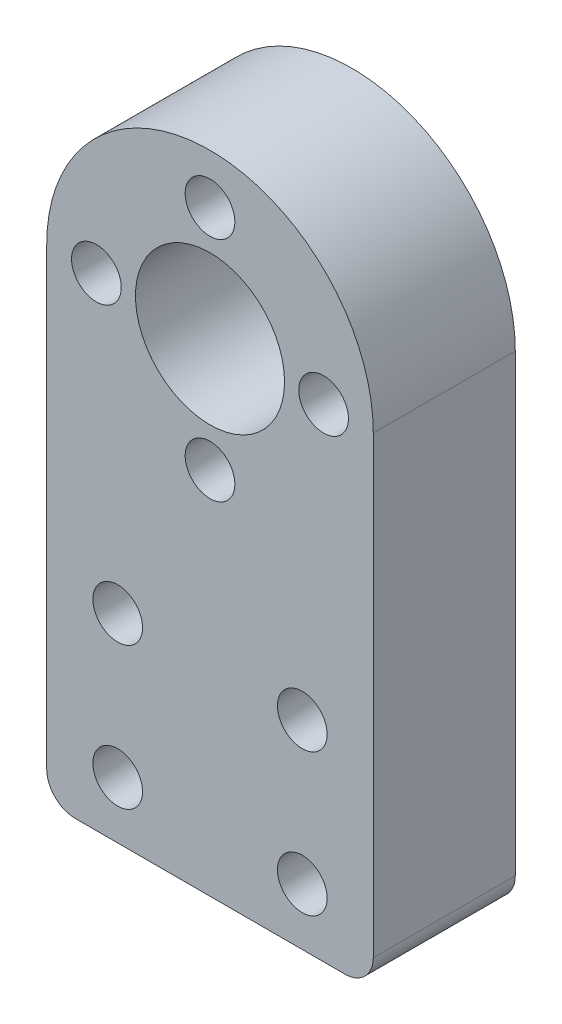
ISO-10303-21;
HEADER;
FILE_DESCRIPTION(('STEP AP214'),'2;1');
FILE_NAME('part.step','',(''),(''),'','','');
FILE_SCHEMA(('AUTOMOTIVE_DESIGN { 1 0 10303 214 1 1 1 1 }'));
ENDSEC;
DATA;
#1=APPLICATION_CONTEXT('core data for automotive mechanical design processes');
#2=APPLICATION_PROTOCOL_DEFINITION('international standard','automotive_design',2000,#1);
#3=PRODUCT_CONTEXT('',#1,'mechanical');
#4=PRODUCT('Part','Part','',(#3));
#5=PRODUCT_RELATED_PRODUCT_CATEGORY('part','',(#4));
#6=PRODUCT_DEFINITION_FORMATION('','',#4);
#7=PRODUCT_DEFINITION_CONTEXT('part definition',#1,'design');
#8=PRODUCT_DEFINITION('design','',#6,#7);
#9=PRODUCT_DEFINITION_SHAPE('','',#8);
#10=(LENGTH_UNIT() NAMED_UNIT(*) SI_UNIT(.MILLI.,.METRE.));
#11=(NAMED_UNIT(*) PLANE_ANGLE_UNIT() SI_UNIT($,.RADIAN.));
#12=(NAMED_UNIT(*) SI_UNIT($,.STERADIAN.) SOLID_ANGLE_UNIT());
#13=UNCERTAINTY_MEASURE_WITH_UNIT(LENGTH_MEASURE(1.E-05),#10,'distance_accuracy_value','');
#14=(GEOMETRIC_REPRESENTATION_CONTEXT(3) GLOBAL_UNCERTAINTY_ASSIGNED_CONTEXT((#13)) GLOBAL_UNIT_ASSIGNED_CONTEXT((#10,
#11,#12)) REPRESENTATION_CONTEXT('',''));
#15=CARTESIAN_POINT('',(0.,0.,0.));
#16=DIRECTION('',(0.,0.,1.));
#17=DIRECTION('',(1.,0.,0.));
#18=AXIS2_PLACEMENT_3D('',#15,#16,#17);
#19=CARTESIAN_POINT('',(0.,17.,10.));
#20=DIRECTION('',(0.,0.,-1.));
#21=DIRECTION('',(-1.,0.,0.));
#22=AXIS2_PLACEMENT_3D('',#19,#20,#21);
#23=CYLINDRICAL_SURFACE('',#22,11.5);
#24=CARTESIAN_POINT('',(0.,17.,0.));
#25=DIRECTION('',(0.,0.,1.));
#26=DIRECTION('',(1.,0.,0.));
#27=AXIS2_PLACEMENT_3D('',#24,#25,#26);
#28=CIRCLE('',#27,11.5);
#29=CARTESIAN_POINT('',(11.5,17.,0.));
#30=VERTEX_POINT('',#29);
#31=CARTESIAN_POINT('',(-11.5,17.,0.));
#32=VERTEX_POINT('',#31);
#33=EDGE_CURVE('E106',#30,#32,#28,.T.);
#34=ORIENTED_EDGE('',*,*,#33,.T.);
#35=DIRECTION('',(0.,0.,-1.));
#36=VECTOR('',#35,1.);
#37=CARTESIAN_POINT('',(-11.5,17.,10.));
#38=LINE('',#37,#36);
#39=CARTESIAN_POINT('',(-11.5,17.,10.));
#40=VERTEX_POINT('',#39);
#41=EDGE_CURVE('E91',#40,#32,#38,.T.);
#42=ORIENTED_EDGE('',*,*,#41,.F.);
#43=CARTESIAN_POINT('',(0.,17.,10.));
#44=DIRECTION('',(0.,0.,1.));
#45=DIRECTION('',(1.,0.,0.));
#46=AXIS2_PLACEMENT_3D('',#43,#44,#45);
#47=CIRCLE('',#46,11.5);
#48=CARTESIAN_POINT('',(11.5,17.,10.));
#49=VERTEX_POINT('',#48);
#50=EDGE_CURVE('E95',#49,#40,#47,.T.);
#51=ORIENTED_EDGE('',*,*,#50,.F.);
#52=DIRECTION('',(0.,0.,-1.));
#53=VECTOR('',#52,1.);
#54=CARTESIAN_POINT('',(11.5,17.,10.));
#55=LINE('',#54,#53);
#56=EDGE_CURVE('E108',#49,#30,#55,.T.);
#57=ORIENTED_EDGE('',*,*,#56,.T.);
#58=EDGE_LOOP('',(#34,#42,#51,#57));
#59=FACE_BOUND('',#58,.T.);
#60=ADVANCED_FACE('F34',(#59),#23,.T.);
#61=CARTESIAN_POINT('',(-11.5,-17.,10.));
#62=DIRECTION('',(1.,0.,0.));
#63=DIRECTION('',(0.,0.,-1.));
#64=AXIS2_PLACEMENT_3D('',#61,#62,#63);
#65=PLANE('',#64);
#66=DIRECTION('',(0.,-1.,0.));
#67=VECTOR('',#66,1.);
#68=CARTESIAN_POINT('',(-11.5,-17.,0.));
#69=LINE('',#68,#67);
#70=CARTESIAN_POINT('',(-11.5,-15.,0.));
#71=VERTEX_POINT('',#70);
#72=EDGE_CURVE('E134',#32,#71,#69,.T.);
#73=ORIENTED_EDGE('',*,*,#72,.T.);
#74=DIRECTION('',(0.,0.,-1.));
#75=VECTOR('',#74,1.);
#76=CARTESIAN_POINT('',(-11.5,-15.,10.));
#77=LINE('',#76,#75);
#78=CARTESIAN_POINT('',(-11.5,-15.,10.));
#79=VERTEX_POINT('',#78);
#80=EDGE_CURVE('E57',#71,#79,#77,.F.);
#81=ORIENTED_EDGE('',*,*,#80,.T.);
#82=DIRECTION('',(0.,-1.,0.));
#83=VECTOR('',#82,1.);
#84=CARTESIAN_POINT('',(-11.5,-17.,10.));
#85=LINE('',#84,#83);
#86=EDGE_CURVE('E87',#40,#79,#85,.T.);
#87=ORIENTED_EDGE('',*,*,#86,.F.);
#88=ORIENTED_EDGE('',*,*,#41,.T.);
#89=EDGE_LOOP('',(#73,#81,#87,#88));
#90=FACE_BOUND('',#89,.T.);
#91=ADVANCED_FACE('F89',(#90),#65,.F.);
#92=CARTESIAN_POINT('',(11.5,-17.,10.));
#93=DIRECTION('',(0.,1.,0.));
#94=DIRECTION('',(-1.,0.,0.));
#95=AXIS2_PLACEMENT_3D('',#92,#93,#94);
#96=PLANE('',#95);
#97=DIRECTION('',(1.,0.,0.));
#98=VECTOR('',#97,1.);
#99=CARTESIAN_POINT('',(11.5,-17.,10.));
#100=LINE('',#99,#98);
#101=CARTESIAN_POINT('',(-9.5,-17.,10.));
#102=VERTEX_POINT('',#101);
#103=CARTESIAN_POINT('',(9.5,-17.,10.));
#104=VERTEX_POINT('',#103);
#105=EDGE_CURVE('E94',#102,#104,#100,.T.);
#106=ORIENTED_EDGE('',*,*,#105,.F.);
#107=DIRECTION('',(0.,0.,-1.));
#108=VECTOR('',#107,1.);
#109=CARTESIAN_POINT('',(-9.5,-17.,10.));
#110=LINE('',#109,#108);
#111=CARTESIAN_POINT('',(-9.5,-17.,0.));
#112=VERTEX_POINT('',#111);
#113=EDGE_CURVE('E110',#102,#112,#110,.T.);
#114=ORIENTED_EDGE('',*,*,#113,.T.);
#115=DIRECTION('',(1.,0.,0.));
#116=VECTOR('',#115,1.);
#117=CARTESIAN_POINT('',(11.5,-17.,0.));
#118=LINE('',#117,#116);
#119=CARTESIAN_POINT('',(9.5,-17.,0.));
#120=VERTEX_POINT('',#119);
#121=EDGE_CURVE('E135',#112,#120,#118,.T.);
#122=ORIENTED_EDGE('',*,*,#121,.T.);
#123=DIRECTION('',(0.,0.,-1.));
#124=VECTOR('',#123,1.);
#125=CARTESIAN_POINT('',(9.5,-17.,10.));
#126=LINE('',#125,#124);
#127=EDGE_CURVE('E107',#120,#104,#126,.F.);
#128=ORIENTED_EDGE('',*,*,#127,.T.);
#129=EDGE_LOOP('',(#106,#114,#122,#128));
#130=FACE_BOUND('',#129,.T.);
#131=ADVANCED_FACE('F126',(#130),#96,.F.);
#132=CARTESIAN_POINT('',(11.5,-17.,10.));
#133=DIRECTION('',(-1.,0.,0.));
#134=DIRECTION('',(0.,0.,1.));
#135=AXIS2_PLACEMENT_3D('',#132,#133,#134);
#136=PLANE('',#135);
#137=DIRECTION('',(0.,1.,0.));
#138=VECTOR('',#137,1.);
#139=CARTESIAN_POINT('',(11.5,-17.,10.));
#140=LINE('',#139,#138);
#141=CARTESIAN_POINT('',(11.5,-15.,10.));
#142=VERTEX_POINT('',#141);
#143=EDGE_CURVE('E99',#142,#49,#140,.T.);
#144=ORIENTED_EDGE('',*,*,#143,.F.);
#145=DIRECTION('',(0.,0.,-1.));
#146=VECTOR('',#145,1.);
#147=CARTESIAN_POINT('',(11.5,-15.,10.));
#148=LINE('',#147,#146);
#149=CARTESIAN_POINT('',(11.5,-15.,0.));
#150=VERTEX_POINT('',#149);
#151=EDGE_CURVE('E11',#142,#150,#148,.T.);
#152=ORIENTED_EDGE('',*,*,#151,.T.);
#153=DIRECTION('',(0.,1.,0.));
#154=VECTOR('',#153,1.);
#155=CARTESIAN_POINT('',(11.5,-17.,0.));
#156=LINE('',#155,#154);
#157=EDGE_CURVE('E103',#150,#30,#156,.T.);
#158=ORIENTED_EDGE('',*,*,#157,.T.);
#159=ORIENTED_EDGE('',*,*,#56,.F.);
#160=EDGE_LOOP('',(#144,#152,#158,#159));
#161=FACE_BOUND('',#160,.T.);
#162=ADVANCED_FACE('F143',(#161),#136,.F.);
#163=CARTESIAN_POINT('',(0.,17.,10.));
#164=DIRECTION('',(0.,0.,1.));
#165=DIRECTION('',(1.,0.,0.));
#166=AXIS2_PLACEMENT_3D('',#163,#164,#165);
#167=PLANE('',#166);
#168=CARTESIAN_POINT('',(6.5,-13.,10.));
#169=DIRECTION('',(0.,0.,1.));
#170=DIRECTION('',(1.,0.,0.));
#171=AXIS2_PLACEMENT_3D('',#168,#169,#170);
#172=CIRCLE('',#171,1.75);
#173=CARTESIAN_POINT('',(8.25,-13.,10.));
#174=VERTEX_POINT('',#173);
#175=EDGE_CURVE('E228',#174,#174,#172,.F.);
#176=ORIENTED_EDGE('',*,*,#175,.T.);
#177=EDGE_LOOP('',(#176));
#178=FACE_BOUND('',#177,.T.);
#179=CARTESIAN_POINT('',(-6.5,-13.,10.));
#180=DIRECTION('',(0.,0.,1.));
#181=DIRECTION('',(1.,0.,0.));
#182=AXIS2_PLACEMENT_3D('',#179,#180,#181);
#183=CIRCLE('',#182,1.75);
#184=CARTESIAN_POINT('',(-4.75,-13.,10.));
#185=VERTEX_POINT('',#184);
#186=EDGE_CURVE('E222',#185,#185,#183,.F.);
#187=ORIENTED_EDGE('',*,*,#186,.T.);
#188=EDGE_LOOP('',(#187));
#189=FACE_BOUND('',#188,.T.);
#190=CARTESIAN_POINT('',(-6.5,-3.,10.));
#191=DIRECTION('',(0.,0.,1.));
#192=DIRECTION('',(1.,0.,0.));
#193=AXIS2_PLACEMENT_3D('',#190,#191,#192);
#194=CIRCLE('',#193,1.75);
#195=CARTESIAN_POINT('',(-4.75,-3.,10.));
#196=VERTEX_POINT('',#195);
#197=EDGE_CURVE('E207',#196,#196,#194,.F.);
#198=ORIENTED_EDGE('',*,*,#197,.T.);
#199=EDGE_LOOP('',(#198));
#200=FACE_BOUND('',#199,.T.);
#201=CARTESIAN_POINT('',(6.5,-3.,10.));
#202=DIRECTION('',(0.,0.,1.));
#203=DIRECTION('',(1.,0.,0.));
#204=AXIS2_PLACEMENT_3D('',#201,#202,#203);
#205=CIRCLE('',#204,1.75);
#206=CARTESIAN_POINT('',(8.25,-3.,10.));
#207=VERTEX_POINT('',#206);
#208=EDGE_CURVE('E212',#207,#207,#205,.F.);
#209=ORIENTED_EDGE('',*,*,#208,.T.);
#210=EDGE_LOOP('',(#209));
#211=FACE_BOUND('',#210,.T.);
#212=CARTESIAN_POINT('',(0.,25.,10.));
#213=DIRECTION('',(0.,0.,1.));
#214=DIRECTION('',(1.,0.,0.));
#215=AXIS2_PLACEMENT_3D('',#212,#213,#214);
#216=CIRCLE('',#215,1.75);
#217=CARTESIAN_POINT('',(1.75,25.,10.));
#218=VERTEX_POINT('',#217);
#219=EDGE_CURVE('E238',#218,#218,#216,.F.);
#220=ORIENTED_EDGE('',*,*,#219,.T.);
#221=EDGE_LOOP('',(#220));
#222=FACE_BOUND('',#221,.T.);
#223=CARTESIAN_POINT('',(-8.,17.,10.));
#224=DIRECTION('',(0.,0.,1.));
#225=DIRECTION('',(1.,0.,0.));
#226=AXIS2_PLACEMENT_3D('',#223,#224,#225);
#227=CIRCLE('',#226,1.75);
#228=CARTESIAN_POINT('',(-6.25,17.,10.));
#229=VERTEX_POINT('',#228);
#230=EDGE_CURVE('E244',#229,#229,#227,.F.);
#231=ORIENTED_EDGE('',*,*,#230,.T.);
#232=EDGE_LOOP('',(#231));
#233=FACE_BOUND('',#232,.T.);
#234=CARTESIAN_POINT('',(0.,9.00000000000001,10.));
#235=DIRECTION('',(0.,0.,1.));
#236=DIRECTION('',(1.,0.,0.));
#237=AXIS2_PLACEMENT_3D('',#234,#235,#236);
#238=CIRCLE('',#237,1.75);
#239=CARTESIAN_POINT('',(1.75,9.00000000000001,10.));
#240=VERTEX_POINT('',#239);
#241=EDGE_CURVE('E250',#240,#240,#238,.F.);
#242=ORIENTED_EDGE('',*,*,#241,.T.);
#243=EDGE_LOOP('',(#242));
#244=FACE_BOUND('',#243,.T.);
#245=CARTESIAN_POINT('',(8.,17.,10.));
#246=DIRECTION('',(0.,0.,1.));
#247=DIRECTION('',(1.,0.,0.));
#248=AXIS2_PLACEMENT_3D('',#245,#246,#247);
#249=CIRCLE('',#248,1.75);
#250=CARTESIAN_POINT('',(9.75,17.,10.));
#251=VERTEX_POINT('',#250);
#252=EDGE_CURVE('E232',#251,#251,#249,.F.);
#253=ORIENTED_EDGE('',*,*,#252,.T.);
#254=EDGE_LOOP('',(#253));
#255=FACE_BOUND('',#254,.T.);
#256=CARTESIAN_POINT('',(0.,17.,10.));
#257=DIRECTION('',(0.,0.,1.));
#258=DIRECTION('',(1.,0.,0.));
#259=AXIS2_PLACEMENT_3D('',#256,#257,#258);
#260=CIRCLE('',#259,5.25);
#261=CARTESIAN_POINT('',(5.25,17.,10.));
#262=VERTEX_POINT('',#261);
#263=EDGE_CURVE('E237',#262,#262,#260,.T.);
#264=ORIENTED_EDGE('',*,*,#263,.F.);
#265=EDGE_LOOP('',(#264));
#266=FACE_BOUND('',#265,.T.);
#267=ORIENTED_EDGE('',*,*,#86,.T.);
#268=CARTESIAN_POINT('',(-9.5,-15.,10.));
#269=DIRECTION('',(0.,0.,1.));
#270=DIRECTION('',(1.,0.,0.));
#271=AXIS2_PLACEMENT_3D('',#268,#269,#270);
#272=CIRCLE('',#271,2.);
#273=EDGE_CURVE('E42',#79,#102,#272,.T.);
#274=ORIENTED_EDGE('',*,*,#273,.T.);
#275=ORIENTED_EDGE('',*,*,#105,.T.);
#276=CARTESIAN_POINT('',(9.5,-15.,10.));
#277=DIRECTION('',(0.,0.,1.));
#278=DIRECTION('',(1.,0.,0.));
#279=AXIS2_PLACEMENT_3D('',#276,#277,#278);
#280=CIRCLE('',#279,2.);
#281=EDGE_CURVE('E49',#104,#142,#280,.T.);
#282=ORIENTED_EDGE('',*,*,#281,.T.);
#283=ORIENTED_EDGE('',*,*,#143,.T.);
#284=ORIENTED_EDGE('',*,*,#50,.T.);
#285=EDGE_LOOP('',(#267,#274,#275,#282,#283,#284));
#286=FACE_BOUND('',#285,.T.);
#287=ADVANCED_FACE('F98',(#178,#189,#200,#211,#222,#233,#244,#255,#266,#286),#167,.T.);
#288=CARTESIAN_POINT('',(0.,17.,0.));
#289=DIRECTION('',(0.,0.,1.));
#290=DIRECTION('',(1.,0.,0.));
#291=AXIS2_PLACEMENT_3D('',#288,#289,#290);
#292=PLANE('',#291);
#293=CARTESIAN_POINT('',(6.5,-13.,0.));
#294=DIRECTION('',(0.,0.,-1.));
#295=DIRECTION('',(-1.,0.,0.));
#296=AXIS2_PLACEMENT_3D('',#293,#294,#295);
#297=CIRCLE('',#296,1.75);
#298=CARTESIAN_POINT('',(4.75,-13.,0.));
#299=VERTEX_POINT('',#298);
#300=EDGE_CURVE('E225',#299,#299,#297,.T.);
#301=ORIENTED_EDGE('',*,*,#300,.F.);
#302=EDGE_LOOP('',(#301));
#303=FACE_BOUND('',#302,.T.);
#304=CARTESIAN_POINT('',(-6.5,-13.,0.));
#305=DIRECTION('',(0.,0.,-1.));
#306=DIRECTION('',(-1.,0.,0.));
#307=AXIS2_PLACEMENT_3D('',#304,#305,#306);
#308=CIRCLE('',#307,1.75);
#309=CARTESIAN_POINT('',(-8.25,-13.,0.));
#310=VERTEX_POINT('',#309);
#311=EDGE_CURVE('E217',#310,#310,#308,.T.);
#312=ORIENTED_EDGE('',*,*,#311,.F.);
#313=EDGE_LOOP('',(#312));
#314=FACE_BOUND('',#313,.T.);
#315=CARTESIAN_POINT('',(-6.5,-3.,0.));
#316=DIRECTION('',(0.,0.,-1.));
#317=DIRECTION('',(-1.,0.,0.));
#318=AXIS2_PLACEMENT_3D('',#315,#316,#317);
#319=CIRCLE('',#318,1.75);
#320=CARTESIAN_POINT('',(-8.25,-3.,0.));
#321=VERTEX_POINT('',#320);
#322=EDGE_CURVE('E210',#321,#321,#319,.T.);
#323=ORIENTED_EDGE('',*,*,#322,.F.);
#324=EDGE_LOOP('',(#323));
#325=FACE_BOUND('',#324,.T.);
#326=CARTESIAN_POINT('',(6.5,-3.,0.));
#327=DIRECTION('',(0.,0.,-1.));
#328=DIRECTION('',(-1.,0.,0.));
#329=AXIS2_PLACEMENT_3D('',#326,#327,#328);
#330=CIRCLE('',#329,1.75);
#331=CARTESIAN_POINT('',(4.75,-3.,0.));
#332=VERTEX_POINT('',#331);
#333=EDGE_CURVE('E215',#332,#332,#330,.T.);
#334=ORIENTED_EDGE('',*,*,#333,.F.);
#335=EDGE_LOOP('',(#334));
#336=FACE_BOUND('',#335,.T.);
#337=CARTESIAN_POINT('',(0.,25.,0.));
#338=DIRECTION('',(0.,0.,-1.));
#339=DIRECTION('',(-1.,0.,0.));
#340=AXIS2_PLACEMENT_3D('',#337,#338,#339);
#341=CIRCLE('',#340,1.75);
#342=CARTESIAN_POINT('',(-1.75,25.,0.));
#343=VERTEX_POINT('',#342);
#344=EDGE_CURVE('E234',#343,#343,#341,.T.);
#345=ORIENTED_EDGE('',*,*,#344,.F.);
#346=EDGE_LOOP('',(#345));
#347=FACE_BOUND('',#346,.T.);
#348=CARTESIAN_POINT('',(-8.,17.,0.));
#349=DIRECTION('',(0.,0.,-1.));
#350=DIRECTION('',(-1.,0.,0.));
#351=AXIS2_PLACEMENT_3D('',#348,#349,#350);
#352=CIRCLE('',#351,1.75);
#353=CARTESIAN_POINT('',(-9.75,17.,0.));
#354=VERTEX_POINT('',#353);
#355=EDGE_CURVE('E241',#354,#354,#352,.T.);
#356=ORIENTED_EDGE('',*,*,#355,.F.);
#357=EDGE_LOOP('',(#356));
#358=FACE_BOUND('',#357,.T.);
#359=CARTESIAN_POINT('',(0.,9.00000000000001,0.));
#360=DIRECTION('',(0.,0.,-1.));
#361=DIRECTION('',(-1.,0.,0.));
#362=AXIS2_PLACEMENT_3D('',#359,#360,#361);
#363=CIRCLE('',#362,1.75);
#364=CARTESIAN_POINT('',(-1.75,9.00000000000001,0.));
#365=VERTEX_POINT('',#364);
#366=EDGE_CURVE('E247',#365,#365,#363,.T.);
#367=ORIENTED_EDGE('',*,*,#366,.F.);
#368=EDGE_LOOP('',(#367));
#369=FACE_BOUND('',#368,.T.);
#370=CARTESIAN_POINT('',(8.,17.,0.));
#371=DIRECTION('',(0.,0.,-1.));
#372=DIRECTION('',(-1.,0.,0.));
#373=AXIS2_PLACEMENT_3D('',#370,#371,#372);
#374=CIRCLE('',#373,1.75);
#375=CARTESIAN_POINT('',(6.25,17.,0.));
#376=VERTEX_POINT('',#375);
#377=EDGE_CURVE('E253',#376,#376,#374,.T.);
#378=ORIENTED_EDGE('',*,*,#377,.F.);
#379=EDGE_LOOP('',(#378));
#380=FACE_BOUND('',#379,.T.);
#381=CARTESIAN_POINT('',(0.,17.,0.));
#382=DIRECTION('',(0.,0.,1.));
#383=DIRECTION('',(1.,0.,0.));
#384=AXIS2_PLACEMENT_3D('',#381,#382,#383);
#385=CIRCLE('',#384,5.25);
#386=CARTESIAN_POINT('',(5.25,17.,0.));
#387=VERTEX_POINT('',#386);
#388=EDGE_CURVE('E138',#387,#387,#385,.F.);
#389=ORIENTED_EDGE('',*,*,#388,.F.);
#390=EDGE_LOOP('',(#389));
#391=FACE_BOUND('',#390,.T.);
#392=ORIENTED_EDGE('',*,*,#121,.F.);
#393=CARTESIAN_POINT('',(-9.5,-15.,0.));
#394=DIRECTION('',(0.,0.,1.));
#395=DIRECTION('',(1.,0.,0.));
#396=AXIS2_PLACEMENT_3D('',#393,#394,#395);
#397=CIRCLE('',#396,2.);
#398=EDGE_CURVE('E119',#112,#71,#397,.F.);
#399=ORIENTED_EDGE('',*,*,#398,.T.);
#400=ORIENTED_EDGE('',*,*,#72,.F.);
#401=ORIENTED_EDGE('',*,*,#33,.F.);
#402=ORIENTED_EDGE('',*,*,#157,.F.);
#403=CARTESIAN_POINT('',(9.5,-15.,0.));
#404=DIRECTION('',(0.,0.,1.));
#405=DIRECTION('',(1.,0.,0.));
#406=AXIS2_PLACEMENT_3D('',#403,#404,#405);
#407=CIRCLE('',#406,2.);
#408=EDGE_CURVE('E117',#150,#120,#407,.F.);
#409=ORIENTED_EDGE('',*,*,#408,.T.);
#410=EDGE_LOOP('',(#392,#399,#400,#401,#402,#409));
#411=FACE_BOUND('',#410,.T.);
#412=ADVANCED_FACE('F133',(#303,#314,#325,#336,#347,#358,#369,#380,#391,#411),#292,.F.);
#413=CARTESIAN_POINT('',(0.,17.,-0.000999999999999265));
#414=DIRECTION('',(0.,0.,1.));
#415=DIRECTION('',(1.,0.,0.));
#416=AXIS2_PLACEMENT_3D('',#413,#414,#415);
#417=CYLINDRICAL_SURFACE('',#416,5.25);
#418=ORIENTED_EDGE('',*,*,#263,.T.);
#419=EDGE_LOOP('',(#418));
#420=FACE_BOUND('',#419,.T.);
#421=ORIENTED_EDGE('',*,*,#388,.T.);
#422=EDGE_LOOP('',(#421));
#423=FACE_BOUND('',#422,.T.);
#424=ADVANCED_FACE('F164',(#420,#423),#417,.F.);
#425=CARTESIAN_POINT('',(8.,17.,10.001));
#426=DIRECTION('',(0.,0.,-1.));
#427=DIRECTION('',(-1.,0.,0.));
#428=AXIS2_PLACEMENT_3D('',#425,#426,#427);
#429=CYLINDRICAL_SURFACE('',#428,1.75);
#430=ORIENTED_EDGE('',*,*,#252,.F.);
#431=EDGE_LOOP('',(#430));
#432=FACE_BOUND('',#431,.T.);
#433=ORIENTED_EDGE('',*,*,#377,.T.);
#434=EDGE_LOOP('',(#433));
#435=FACE_BOUND('',#434,.T.);
#436=ADVANCED_FACE('F171',(#432,#435),#429,.F.);
#437=CARTESIAN_POINT('',(0.,9.00000000000001,10.001));
#438=DIRECTION('',(0.,0.,-1.));
#439=DIRECTION('',(-1.,0.,0.));
#440=AXIS2_PLACEMENT_3D('',#437,#438,#439);
#441=CYLINDRICAL_SURFACE('',#440,1.75);
#442=ORIENTED_EDGE('',*,*,#241,.F.);
#443=EDGE_LOOP('',(#442));
#444=FACE_BOUND('',#443,.T.);
#445=ORIENTED_EDGE('',*,*,#366,.T.);
#446=EDGE_LOOP('',(#445));
#447=FACE_BOUND('',#446,.T.);
#448=ADVANCED_FACE('F175',(#444,#447),#441,.F.);
#449=CARTESIAN_POINT('',(-8.,17.,10.001));
#450=DIRECTION('',(0.,0.,-1.));
#451=DIRECTION('',(-1.,0.,0.));
#452=AXIS2_PLACEMENT_3D('',#449,#450,#451);
#453=CYLINDRICAL_SURFACE('',#452,1.75);
#454=ORIENTED_EDGE('',*,*,#230,.F.);
#455=EDGE_LOOP('',(#454));
#456=FACE_BOUND('',#455,.T.);
#457=ORIENTED_EDGE('',*,*,#355,.T.);
#458=EDGE_LOOP('',(#457));
#459=FACE_BOUND('',#458,.T.);
#460=ADVANCED_FACE('F179',(#456,#459),#453,.F.);
#461=CARTESIAN_POINT('',(0.,25.,10.001));
#462=DIRECTION('',(0.,0.,-1.));
#463=DIRECTION('',(-1.,0.,0.));
#464=AXIS2_PLACEMENT_3D('',#461,#462,#463);
#465=CYLINDRICAL_SURFACE('',#464,1.75);
#466=ORIENTED_EDGE('',*,*,#219,.F.);
#467=EDGE_LOOP('',(#466));
#468=FACE_BOUND('',#467,.T.);
#469=ORIENTED_EDGE('',*,*,#344,.T.);
#470=EDGE_LOOP('',(#469));
#471=FACE_BOUND('',#470,.T.);
#472=ADVANCED_FACE('F183',(#468,#471),#465,.F.);
#473=CARTESIAN_POINT('',(6.5,-3.,10.001));
#474=DIRECTION('',(0.,0.,-1.));
#475=DIRECTION('',(-1.,0.,0.));
#476=AXIS2_PLACEMENT_3D('',#473,#474,#475);
#477=CYLINDRICAL_SURFACE('',#476,1.75);
#478=ORIENTED_EDGE('',*,*,#208,.F.);
#479=EDGE_LOOP('',(#478));
#480=FACE_BOUND('',#479,.T.);
#481=ORIENTED_EDGE('',*,*,#333,.T.);
#482=EDGE_LOOP('',(#481));
#483=FACE_BOUND('',#482,.T.);
#484=ADVANCED_FACE('F187',(#480,#483),#477,.F.);
#485=CARTESIAN_POINT('',(-6.5,-3.,10.001));
#486=DIRECTION('',(0.,0.,-1.));
#487=DIRECTION('',(-1.,0.,0.));
#488=AXIS2_PLACEMENT_3D('',#485,#486,#487);
#489=CYLINDRICAL_SURFACE('',#488,1.75);
#490=ORIENTED_EDGE('',*,*,#197,.F.);
#491=EDGE_LOOP('',(#490));
#492=FACE_BOUND('',#491,.T.);
#493=ORIENTED_EDGE('',*,*,#322,.T.);
#494=EDGE_LOOP('',(#493));
#495=FACE_BOUND('',#494,.T.);
#496=ADVANCED_FACE('F191',(#492,#495),#489,.F.);
#497=CARTESIAN_POINT('',(-6.5,-13.,10.001));
#498=DIRECTION('',(0.,0.,-1.));
#499=DIRECTION('',(-1.,0.,0.));
#500=AXIS2_PLACEMENT_3D('',#497,#498,#499);
#501=CYLINDRICAL_SURFACE('',#500,1.75);
#502=ORIENTED_EDGE('',*,*,#186,.F.);
#503=EDGE_LOOP('',(#502));
#504=FACE_BOUND('',#503,.T.);
#505=ORIENTED_EDGE('',*,*,#311,.T.);
#506=EDGE_LOOP('',(#505));
#507=FACE_BOUND('',#506,.T.);
#508=ADVANCED_FACE('F195',(#504,#507),#501,.F.);
#509=CARTESIAN_POINT('',(6.5,-13.,10.001));
#510=DIRECTION('',(0.,0.,-1.));
#511=DIRECTION('',(-1.,0.,0.));
#512=AXIS2_PLACEMENT_3D('',#509,#510,#511);
#513=CYLINDRICAL_SURFACE('',#512,1.75);
#514=ORIENTED_EDGE('',*,*,#175,.F.);
#515=EDGE_LOOP('',(#514));
#516=FACE_BOUND('',#515,.T.);
#517=ORIENTED_EDGE('',*,*,#300,.T.);
#518=EDGE_LOOP('',(#517));
#519=FACE_BOUND('',#518,.T.);
#520=ADVANCED_FACE('F150',(#516,#519),#513,.F.);
#521=CARTESIAN_POINT('',(-9.5,-15.,10.));
#522=DIRECTION('',(0.,0.,-1.));
#523=DIRECTION('',(-1.,0.,0.));
#524=AXIS2_PLACEMENT_3D('',#521,#522,#523);
#525=CYLINDRICAL_SURFACE('',#524,2.);
#526=ORIENTED_EDGE('',*,*,#273,.F.);
#527=ORIENTED_EDGE('',*,*,#80,.F.);
#528=ORIENTED_EDGE('',*,*,#398,.F.);
#529=ORIENTED_EDGE('',*,*,#113,.F.);
#530=EDGE_LOOP('',(#526,#527,#528,#529));
#531=FACE_BOUND('',#530,.T.);
#532=ADVANCED_FACE('F131',(#531),#525,.T.);
#533=CARTESIAN_POINT('',(9.5,-15.,10.));
#534=DIRECTION('',(0.,0.,-1.));
#535=DIRECTION('',(-1.,0.,0.));
#536=AXIS2_PLACEMENT_3D('',#533,#534,#535);
#537=CYLINDRICAL_SURFACE('',#536,2.);
#538=ORIENTED_EDGE('',*,*,#281,.F.);
#539=ORIENTED_EDGE('',*,*,#127,.F.);
#540=ORIENTED_EDGE('',*,*,#408,.F.);
#541=ORIENTED_EDGE('',*,*,#151,.F.);
#542=EDGE_LOOP('',(#538,#539,#540,#541));
#543=FACE_BOUND('',#542,.T.);
#544=ADVANCED_FACE('F36',(#543),#537,.T.);
#545=CLOSED_SHELL('',(#60,#91,#131,#162,#287,#412,#424,#436,#448,#460,#472,#484,#496,#508,#520,
#532,#544));
#546=MANIFOLD_SOLID_BREP('B2',#545);
#547=ADVANCED_BREP_SHAPE_REPRESENTATION('',(#18,#546),#14);
#548=SHAPE_DEFINITION_REPRESENTATION(#9,#547);
ENDSEC;
END-ISO-10303-21;
